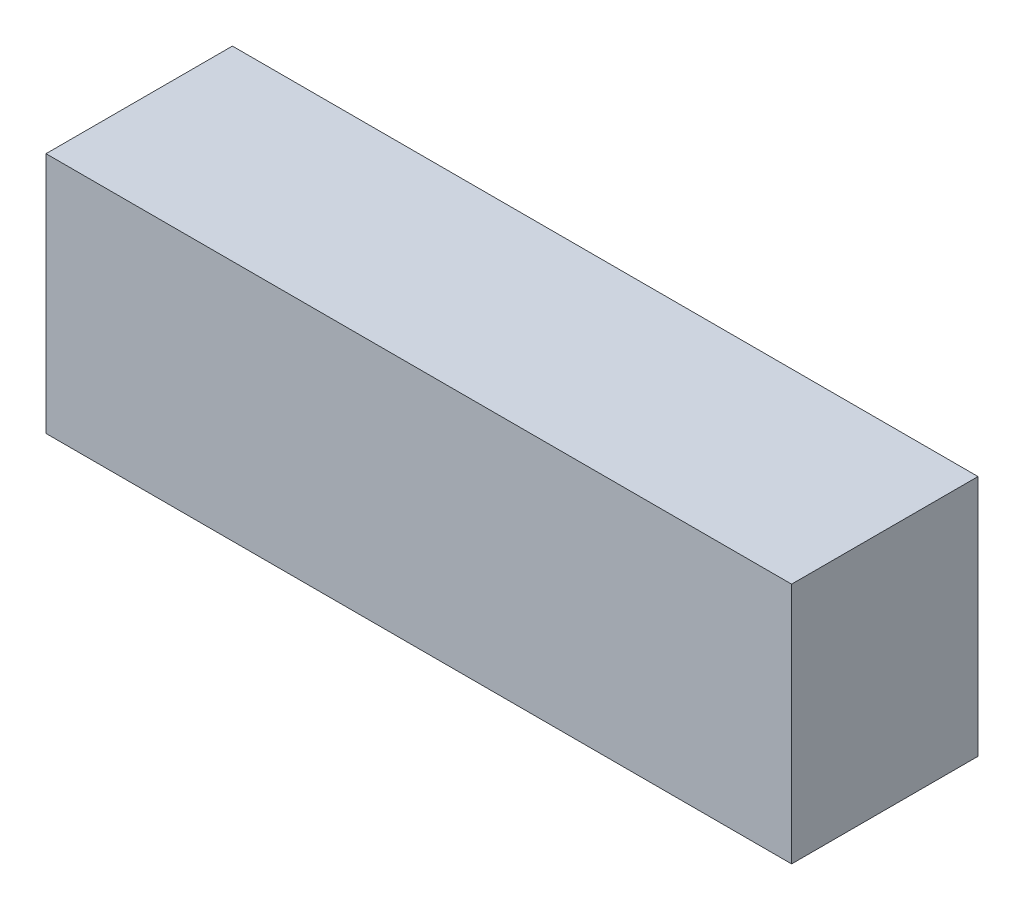
ISO-10303-21;
HEADER;
FILE_DESCRIPTION(('STEP AP214'),'2;1');
FILE_NAME('part.step','',(''),(''),'','','');
FILE_SCHEMA(('AUTOMOTIVE_DESIGN { 1 0 10303 214 1 1 1 1 }'));
ENDSEC;
DATA;
#1=APPLICATION_CONTEXT('core data for automotive mechanical design processes');
#2=APPLICATION_PROTOCOL_DEFINITION('international standard','automotive_design',2000,#1);
#3=PRODUCT_CONTEXT('',#1,'mechanical');
#4=PRODUCT('Part','Part','',(#3));
#5=PRODUCT_RELATED_PRODUCT_CATEGORY('part','',(#4));
#6=PRODUCT_DEFINITION_FORMATION('','',#4);
#7=PRODUCT_DEFINITION_CONTEXT('part definition',#1,'design');
#8=PRODUCT_DEFINITION('design','',#6,#7);
#9=PRODUCT_DEFINITION_SHAPE('','',#8);
#10=(LENGTH_UNIT() NAMED_UNIT(*) SI_UNIT(.MILLI.,.METRE.));
#11=(NAMED_UNIT(*) PLANE_ANGLE_UNIT() SI_UNIT($,.RADIAN.));
#12=(NAMED_UNIT(*) SI_UNIT($,.STERADIAN.) SOLID_ANGLE_UNIT());
#13=UNCERTAINTY_MEASURE_WITH_UNIT(LENGTH_MEASURE(1.E-05),#10,'distance_accuracy_value','');
#14=(GEOMETRIC_REPRESENTATION_CONTEXT(3) GLOBAL_UNCERTAINTY_ASSIGNED_CONTEXT((#13)) GLOBAL_UNIT_ASSIGNED_CONTEXT((#10,
#11,#12)) REPRESENTATION_CONTEXT('',''));
#15=CARTESIAN_POINT('',(0.,0.,0.));
#16=DIRECTION('',(0.,0.,1.));
#17=DIRECTION('',(1.,0.,0.));
#18=AXIS2_PLACEMENT_3D('',#15,#16,#17);
#19=CARTESIAN_POINT('',(0.,0.,10.));
#20=DIRECTION('',(1.,0.,0.));
#21=DIRECTION('',(0.,0.,-1.));
#22=AXIS2_PLACEMENT_3D('',#19,#20,#21);
#23=PLANE('',#22);
#24=DIRECTION('',(0.,-1.,0.));
#25=VECTOR('',#24,1.);
#26=CARTESIAN_POINT('',(0.,0.,0.));
#27=LINE('',#26,#25);
#28=CARTESIAN_POINT('',(0.,13.,0.));
#29=VERTEX_POINT('',#28);
#30=CARTESIAN_POINT('',(0.,0.,0.));
#31=VERTEX_POINT('',#30);
#32=EDGE_CURVE('E106',#29,#31,#27,.T.);
#33=ORIENTED_EDGE('',*,*,#32,.T.);
#34=DIRECTION('',(0.,0.,-1.));
#35=VECTOR('',#34,1.);
#36=CARTESIAN_POINT('',(0.,0.,10.));
#37=LINE('',#36,#35);
#38=CARTESIAN_POINT('',(0.,0.,10.));
#39=VERTEX_POINT('',#38);
#40=EDGE_CURVE('E11',#39,#31,#37,.T.);
#41=ORIENTED_EDGE('',*,*,#40,.F.);
#42=DIRECTION('',(0.,-1.,0.));
#43=VECTOR('',#42,1.);
#44=CARTESIAN_POINT('',(0.,0.,10.));
#45=LINE('',#44,#43);
#46=CARTESIAN_POINT('',(0.,13.,10.));
#47=VERTEX_POINT('',#46);
#48=EDGE_CURVE('E92',#47,#39,#45,.T.);
#49=ORIENTED_EDGE('',*,*,#48,.F.);
#50=DIRECTION('',(0.,0.,-1.));
#51=VECTOR('',#50,1.);
#52=CARTESIAN_POINT('',(0.,13.,10.));
#53=LINE('',#52,#51);
#54=EDGE_CURVE('E105',#47,#29,#53,.T.);
#55=ORIENTED_EDGE('',*,*,#54,.T.);
#56=EDGE_LOOP('',(#33,#41,#49,#55));
#57=FACE_BOUND('',#56,.T.);
#58=ADVANCED_FACE('F43',(#57),#23,.F.);
#59=CARTESIAN_POINT('',(0.,0.,10.));
#60=DIRECTION('',(0.,1.,0.));
#61=DIRECTION('',(0.,0.,1.));
#62=AXIS2_PLACEMENT_3D('',#59,#60,#61);
#63=PLANE('',#62);
#64=DIRECTION('',(1.,0.,0.));
#65=VECTOR('',#64,1.);
#66=CARTESIAN_POINT('',(0.,0.,0.));
#67=LINE('',#66,#65);
#68=CARTESIAN_POINT('',(40.,0.,0.));
#69=VERTEX_POINT('',#68);
#70=EDGE_CURVE('E97',#31,#69,#67,.T.);
#71=ORIENTED_EDGE('',*,*,#70,.T.);
#72=DIRECTION('',(0.,0.,-1.));
#73=VECTOR('',#72,1.);
#74=CARTESIAN_POINT('',(40.,0.,10.));
#75=LINE('',#74,#73);
#76=CARTESIAN_POINT('',(40.,0.,10.));
#77=VERTEX_POINT('',#76);
#78=EDGE_CURVE('E51',#77,#69,#75,.T.);
#79=ORIENTED_EDGE('',*,*,#78,.F.);
#80=DIRECTION('',(1.,0.,0.));
#81=VECTOR('',#80,1.);
#82=CARTESIAN_POINT('',(0.,0.,10.));
#83=LINE('',#82,#81);
#84=EDGE_CURVE('E87',#39,#77,#83,.T.);
#85=ORIENTED_EDGE('',*,*,#84,.F.);
#86=ORIENTED_EDGE('',*,*,#40,.T.);
#87=EDGE_LOOP('',(#71,#79,#85,#86));
#88=FACE_BOUND('',#87,.T.);
#89=ADVANCED_FACE('F100',(#88),#63,.F.);
#90=CARTESIAN_POINT('',(40.,0.,10.));
#91=DIRECTION('',(-1.,0.,0.));
#92=DIRECTION('',(0.,0.,1.));
#93=AXIS2_PLACEMENT_3D('',#90,#91,#92);
#94=PLANE('',#93);
#95=DIRECTION('',(0.,1.,0.));
#96=VECTOR('',#95,1.);
#97=CARTESIAN_POINT('',(40.,0.,0.));
#98=LINE('',#97,#96);
#99=CARTESIAN_POINT('',(40.,13.,0.));
#100=VERTEX_POINT('',#99);
#101=EDGE_CURVE('E78',#69,#100,#98,.T.);
#102=ORIENTED_EDGE('',*,*,#101,.T.);
#103=DIRECTION('',(0.,0.,-1.));
#104=VECTOR('',#103,1.);
#105=CARTESIAN_POINT('',(40.,13.,10.));
#106=LINE('',#105,#104);
#107=CARTESIAN_POINT('',(40.,13.,10.));
#108=VERTEX_POINT('',#107);
#109=EDGE_CURVE('E98',#108,#100,#106,.T.);
#110=ORIENTED_EDGE('',*,*,#109,.F.);
#111=DIRECTION('',(0.,1.,0.));
#112=VECTOR('',#111,1.);
#113=CARTESIAN_POINT('',(40.,0.,10.));
#114=LINE('',#113,#112);
#115=EDGE_CURVE('E95',#77,#108,#114,.T.);
#116=ORIENTED_EDGE('',*,*,#115,.F.);
#117=ORIENTED_EDGE('',*,*,#78,.T.);
#118=EDGE_LOOP('',(#102,#110,#116,#117));
#119=FACE_BOUND('',#118,.T.);
#120=ADVANCED_FACE('F99',(#119),#94,.F.);
#121=CARTESIAN_POINT('',(0.,13.,10.));
#122=DIRECTION('',(0.,-1.,0.));
#123=DIRECTION('',(0.,0.,-1.));
#124=AXIS2_PLACEMENT_3D('',#121,#122,#123);
#125=PLANE('',#124);
#126=DIRECTION('',(-1.,0.,0.));
#127=VECTOR('',#126,1.);
#128=CARTESIAN_POINT('',(0.,13.,0.));
#129=LINE('',#128,#127);
#130=EDGE_CURVE('E85',#100,#29,#129,.T.);
#131=ORIENTED_EDGE('',*,*,#130,.T.);
#132=ORIENTED_EDGE('',*,*,#54,.F.);
#133=DIRECTION('',(-1.,0.,0.));
#134=VECTOR('',#133,1.);
#135=CARTESIAN_POINT('',(0.,13.,10.));
#136=LINE('',#135,#134);
#137=EDGE_CURVE('E56',#108,#47,#136,.T.);
#138=ORIENTED_EDGE('',*,*,#137,.F.);
#139=ORIENTED_EDGE('',*,*,#109,.T.);
#140=EDGE_LOOP('',(#131,#132,#138,#139));
#141=FACE_BOUND('',#140,.T.);
#142=ADVANCED_FACE('F111',(#141),#125,.F.);
#143=CARTESIAN_POINT('',(0.,0.,10.));
#144=DIRECTION('',(0.,0.,-1.));
#145=DIRECTION('',(-1.,0.,0.));
#146=AXIS2_PLACEMENT_3D('',#143,#144,#145);
#147=PLANE('',#146);
#148=ORIENTED_EDGE('',*,*,#48,.T.);
#149=ORIENTED_EDGE('',*,*,#84,.T.);
#150=ORIENTED_EDGE('',*,*,#115,.T.);
#151=ORIENTED_EDGE('',*,*,#137,.T.);
#152=EDGE_LOOP('',(#148,#149,#150,#151));
#153=FACE_BOUND('',#152,.T.);
#154=ADVANCED_FACE('F89',(#153),#147,.F.);
#155=CARTESIAN_POINT('',(0.,0.,0.));
#156=DIRECTION('',(0.,0.,-1.));
#157=DIRECTION('',(-1.,0.,0.));
#158=AXIS2_PLACEMENT_3D('',#155,#156,#157);
#159=PLANE('',#158);
#160=ORIENTED_EDGE('',*,*,#32,.F.);
#161=ORIENTED_EDGE('',*,*,#130,.F.);
#162=ORIENTED_EDGE('',*,*,#101,.F.);
#163=ORIENTED_EDGE('',*,*,#70,.F.);
#164=EDGE_LOOP('',(#160,#161,#162,#163));
#165=FACE_BOUND('',#164,.T.);
#166=ADVANCED_FACE('F116',(#165),#159,.T.);
#167=CLOSED_SHELL('',(#58,#89,#120,#142,#154,#166));
#168=MANIFOLD_SOLID_BREP('B2',#167);
#169=ADVANCED_BREP_SHAPE_REPRESENTATION('',(#18,#168),#14);
#170=SHAPE_DEFINITION_REPRESENTATION(#9,#169);
ENDSEC;
END-ISO-10303-21;
